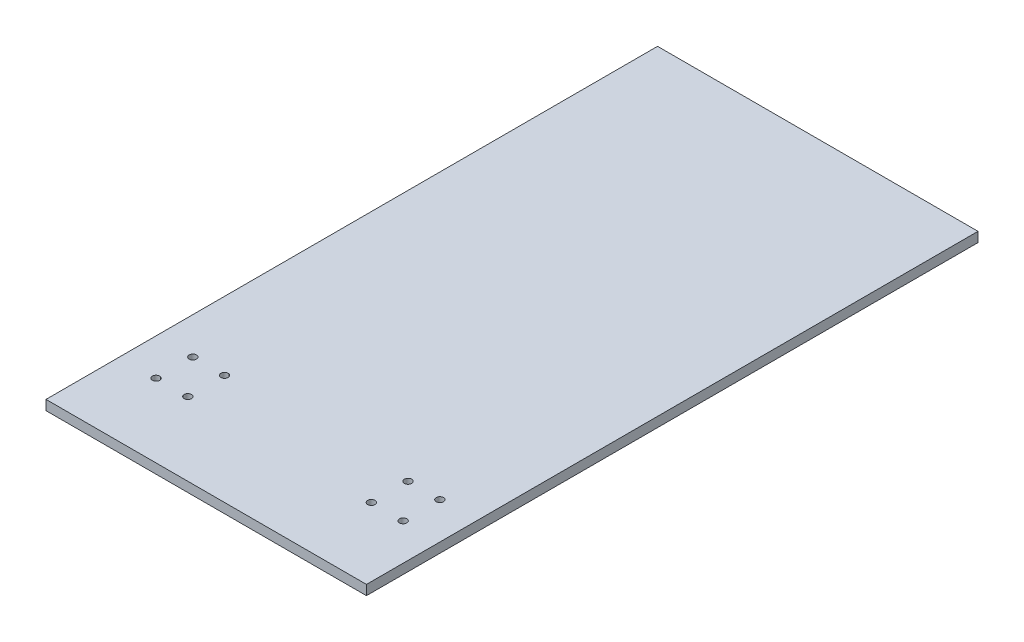
ISO-10303-21;
HEADER;
FILE_DESCRIPTION(('STEP AP214'),'2;1');
FILE_NAME('part.step','',(''),(''),'','','');
FILE_SCHEMA(('AUTOMOTIVE_DESIGN { 1 0 10303 214 1 1 1 1 }'));
ENDSEC;
DATA;
#1=APPLICATION_CONTEXT('core data for automotive mechanical design processes');
#2=APPLICATION_PROTOCOL_DEFINITION('international standard','automotive_design',2000,#1);
#3=PRODUCT_CONTEXT('',#1,'mechanical');
#4=PRODUCT('Part','Part','',(#3));
#5=PRODUCT_RELATED_PRODUCT_CATEGORY('part','',(#4));
#6=PRODUCT_DEFINITION_FORMATION('','',#4);
#7=PRODUCT_DEFINITION_CONTEXT('part definition',#1,'design');
#8=PRODUCT_DEFINITION('design','',#6,#7);
#9=PRODUCT_DEFINITION_SHAPE('','',#8);
#10=(LENGTH_UNIT() NAMED_UNIT(*) SI_UNIT(.MILLI.,.METRE.));
#11=(NAMED_UNIT(*) PLANE_ANGLE_UNIT() SI_UNIT($,.RADIAN.));
#12=(NAMED_UNIT(*) SI_UNIT($,.STERADIAN.) SOLID_ANGLE_UNIT());
#13=UNCERTAINTY_MEASURE_WITH_UNIT(LENGTH_MEASURE(1.E-05),#10,'distance_accuracy_value','');
#14=(GEOMETRIC_REPRESENTATION_CONTEXT(3) GLOBAL_UNCERTAINTY_ASSIGNED_CONTEXT((#13)) GLOBAL_UNIT_ASSIGNED_CONTEXT((#10,
#11,#12)) REPRESENTATION_CONTEXT('',''));
#15=CARTESIAN_POINT('',(0.,0.,0.));
#16=DIRECTION('',(0.,0.,1.));
#17=DIRECTION('',(1.,0.,0.));
#18=AXIS2_PLACEMENT_3D('',#15,#16,#17);
#19=CARTESIAN_POINT('',(0.,4.,0.));
#20=DIRECTION('',(0.,1.,0.));
#21=DIRECTION('',(0.,0.,1.));
#22=AXIS2_PLACEMENT_3D('',#19,#20,#21);
#23=PLANE('',#22);
#24=CARTESIAN_POINT('',(37.5,4.,80.));
#25=DIRECTION('',(0.,1.,0.));
#26=DIRECTION('',(0.,0.,-1.));
#27=AXIS2_PLACEMENT_3D('',#24,#25,#26);
#28=CIRCLE('',#27,1.5);
#29=CARTESIAN_POINT('',(37.5,4.,78.5));
#30=VERTEX_POINT('',#29);
#31=EDGE_CURVE('E146',#30,#30,#28,.T.);
#32=ORIENTED_EDGE('',*,*,#31,.F.);
#33=EDGE_LOOP('',(#32));
#34=FACE_BOUND('',#33,.T.);
#35=CARTESIAN_POINT('',(50.5,4.,95.));
#36=DIRECTION('',(0.,1.,0.));
#37=DIRECTION('',(0.,0.,-1.));
#38=AXIS2_PLACEMENT_3D('',#35,#36,#37);
#39=CIRCLE('',#38,1.5);
#40=CARTESIAN_POINT('',(50.5,4.,93.5));
#41=VERTEX_POINT('',#40);
#42=EDGE_CURVE('E134',#41,#41,#39,.T.);
#43=ORIENTED_EDGE('',*,*,#42,.F.);
#44=EDGE_LOOP('',(#43));
#45=FACE_BOUND('',#44,.T.);
#46=CARTESIAN_POINT('',(-37.5,4.,95.));
#47=DIRECTION('',(0.,1.,0.));
#48=DIRECTION('',(0.,0.,1.));
#49=AXIS2_PLACEMENT_3D('',#46,#47,#48);
#50=CIRCLE('',#49,1.5);
#51=CARTESIAN_POINT('',(-37.5,4.,96.5));
#52=VERTEX_POINT('',#51);
#53=EDGE_CURVE('E122',#52,#52,#50,.T.);
#54=ORIENTED_EDGE('',*,*,#53,.F.);
#55=EDGE_LOOP('',(#54));
#56=FACE_BOUND('',#55,.T.);
#57=CARTESIAN_POINT('',(-50.5,4.,80.));
#58=DIRECTION('',(0.,1.,0.));
#59=DIRECTION('',(0.,0.,1.));
#60=AXIS2_PLACEMENT_3D('',#57,#58,#59);
#61=CIRCLE('',#60,1.5);
#62=CARTESIAN_POINT('',(-50.5,4.,81.5));
#63=VERTEX_POINT('',#62);
#64=EDGE_CURVE('E101',#63,#63,#61,.T.);
#65=ORIENTED_EDGE('',*,*,#64,.F.);
#66=EDGE_LOOP('',(#65));
#67=FACE_BOUND('',#66,.T.);
#68=DIRECTION('',(0.,0.,1.));
#69=VECTOR('',#68,1.);
#70=CARTESIAN_POINT('',(-65.5,4.,-125.));
#71=LINE('',#70,#69);
#72=CARTESIAN_POINT('',(-65.5,4.,-125.));
#73=VERTEX_POINT('',#72);
#74=CARTESIAN_POINT('',(-65.5,4.,125.));
#75=VERTEX_POINT('',#74);
#76=EDGE_CURVE('E86',#73,#75,#71,.T.);
#77=ORIENTED_EDGE('',*,*,#76,.T.);
#78=DIRECTION('',(1.,0.,0.));
#79=VECTOR('',#78,1.);
#80=CARTESIAN_POINT('',(-65.5,4.,125.));
#81=LINE('',#80,#79);
#82=CARTESIAN_POINT('',(65.5,4.,125.));
#83=VERTEX_POINT('',#82);
#84=EDGE_CURVE('E81',#75,#83,#81,.T.);
#85=ORIENTED_EDGE('',*,*,#84,.T.);
#86=DIRECTION('',(0.,0.,-1.));
#87=VECTOR('',#86,1.);
#88=CARTESIAN_POINT('',(65.5,4.,-125.));
#89=LINE('',#88,#87);
#90=CARTESIAN_POINT('',(65.5,4.,-125.));
#91=VERTEX_POINT('',#90);
#92=EDGE_CURVE('E84',#83,#91,#89,.T.);
#93=ORIENTED_EDGE('',*,*,#92,.T.);
#94=DIRECTION('',(-1.,0.,0.));
#95=VECTOR('',#94,1.);
#96=CARTESIAN_POINT('',(-65.5,4.,-125.));
#97=LINE('',#96,#95);
#98=EDGE_CURVE('E51',#91,#73,#97,.T.);
#99=ORIENTED_EDGE('',*,*,#98,.T.);
#100=EDGE_LOOP('',(#77,#85,#93,#99));
#101=FACE_BOUND('',#100,.T.);
#102=CARTESIAN_POINT('',(-37.5,4.,80.));
#103=DIRECTION('',(0.,1.,0.));
#104=DIRECTION('',(0.,0.,1.));
#105=AXIS2_PLACEMENT_3D('',#102,#103,#104);
#106=CIRCLE('',#105,1.5);
#107=CARTESIAN_POINT('',(-37.5,4.,81.5));
#108=VERTEX_POINT('',#107);
#109=EDGE_CURVE('E116',#108,#108,#106,.T.);
#110=ORIENTED_EDGE('',*,*,#109,.F.);
#111=EDGE_LOOP('',(#110));
#112=FACE_BOUND('',#111,.T.);
#113=CARTESIAN_POINT('',(-50.5,4.,95.));
#114=DIRECTION('',(0.,1.,0.));
#115=DIRECTION('',(0.,0.,1.));
#116=AXIS2_PLACEMENT_3D('',#113,#114,#115);
#117=CIRCLE('',#116,1.5);
#118=CARTESIAN_POINT('',(-50.5,4.,96.5));
#119=VERTEX_POINT('',#118);
#120=EDGE_CURVE('E128',#119,#119,#117,.T.);
#121=ORIENTED_EDGE('',*,*,#120,.F.);
#122=EDGE_LOOP('',(#121));
#123=FACE_BOUND('',#122,.T.);
#124=CARTESIAN_POINT('',(37.5,4.,95.));
#125=DIRECTION('',(0.,1.,0.));
#126=DIRECTION('',(0.,0.,-1.));
#127=AXIS2_PLACEMENT_3D('',#124,#125,#126);
#128=CIRCLE('',#127,1.5);
#129=CARTESIAN_POINT('',(37.5,4.,93.5));
#130=VERTEX_POINT('',#129);
#131=EDGE_CURVE('E140',#130,#130,#128,.T.);
#132=ORIENTED_EDGE('',*,*,#131,.F.);
#133=EDGE_LOOP('',(#132));
#134=FACE_BOUND('',#133,.T.);
#135=CARTESIAN_POINT('',(50.5,4.,80.));
#136=DIRECTION('',(0.,1.,0.));
#137=DIRECTION('',(0.,0.,-1.));
#138=AXIS2_PLACEMENT_3D('',#135,#136,#137);
#139=CIRCLE('',#138,1.5);
#140=CARTESIAN_POINT('',(50.5,4.,78.5));
#141=VERTEX_POINT('',#140);
#142=EDGE_CURVE('E152',#141,#141,#139,.T.);
#143=ORIENTED_EDGE('',*,*,#142,.F.);
#144=EDGE_LOOP('',(#143));
#145=FACE_BOUND('',#144,.T.);
#146=ADVANCED_FACE('F34',(#34,#45,#56,#67,#101,#112,#123,#134,#145),#23,.T.);
#147=CARTESIAN_POINT('',(0.,0.,0.));
#148=DIRECTION('',(0.,1.,0.));
#149=DIRECTION('',(0.,0.,1.));
#150=AXIS2_PLACEMENT_3D('',#147,#148,#149);
#151=PLANE('',#150);
#152=DIRECTION('',(0.,0.,1.));
#153=VECTOR('',#152,1.);
#154=CARTESIAN_POINT('',(-65.5,0.,-125.));
#155=LINE('',#154,#153);
#156=CARTESIAN_POINT('',(-65.5,0.,-125.));
#157=VERTEX_POINT('',#156);
#158=CARTESIAN_POINT('',(-65.5,0.,125.));
#159=VERTEX_POINT('',#158);
#160=EDGE_CURVE('E98',#157,#159,#155,.T.);
#161=ORIENTED_EDGE('',*,*,#160,.F.);
#162=DIRECTION('',(-1.,0.,0.));
#163=VECTOR('',#162,1.);
#164=CARTESIAN_POINT('',(-65.5,0.,-125.));
#165=LINE('',#164,#163);
#166=CARTESIAN_POINT('',(65.5,0.,-125.));
#167=VERTEX_POINT('',#166);
#168=EDGE_CURVE('E74',#167,#157,#165,.T.);
#169=ORIENTED_EDGE('',*,*,#168,.F.);
#170=DIRECTION('',(0.,0.,-1.));
#171=VECTOR('',#170,1.);
#172=CARTESIAN_POINT('',(65.5,0.,-125.));
#173=LINE('',#172,#171);
#174=CARTESIAN_POINT('',(65.5,0.,125.));
#175=VERTEX_POINT('',#174);
#176=EDGE_CURVE('E68',#175,#167,#173,.T.);
#177=ORIENTED_EDGE('',*,*,#176,.F.);
#178=DIRECTION('',(1.,0.,0.));
#179=VECTOR('',#178,1.);
#180=CARTESIAN_POINT('',(-65.5,0.,125.));
#181=LINE('',#180,#179);
#182=EDGE_CURVE('E90',#159,#175,#181,.T.);
#183=ORIENTED_EDGE('',*,*,#182,.F.);
#184=EDGE_LOOP('',(#161,#169,#177,#183));
#185=FACE_BOUND('',#184,.T.);
#186=CARTESIAN_POINT('',(-50.5,0.,80.));
#187=DIRECTION('',(0.,1.,0.));
#188=DIRECTION('',(0.,0.,1.));
#189=AXIS2_PLACEMENT_3D('',#186,#187,#188);
#190=CIRCLE('',#189,1.5);
#191=CARTESIAN_POINT('',(-50.5,0.,81.5));
#192=VERTEX_POINT('',#191);
#193=EDGE_CURVE('E113',#192,#192,#190,.T.);
#194=ORIENTED_EDGE('',*,*,#193,.T.);
#195=EDGE_LOOP('',(#194));
#196=FACE_BOUND('',#195,.T.);
#197=CARTESIAN_POINT('',(-37.5,0.,80.));
#198=DIRECTION('',(0.,1.,0.));
#199=DIRECTION('',(0.,0.,1.));
#200=AXIS2_PLACEMENT_3D('',#197,#198,#199);
#201=CIRCLE('',#200,1.5);
#202=CARTESIAN_POINT('',(-37.5,0.,81.5));
#203=VERTEX_POINT('',#202);
#204=EDGE_CURVE('E119',#203,#203,#201,.T.);
#205=ORIENTED_EDGE('',*,*,#204,.T.);
#206=EDGE_LOOP('',(#205));
#207=FACE_BOUND('',#206,.T.);
#208=CARTESIAN_POINT('',(-37.5,0.,95.));
#209=DIRECTION('',(0.,1.,0.));
#210=DIRECTION('',(0.,0.,1.));
#211=AXIS2_PLACEMENT_3D('',#208,#209,#210);
#212=CIRCLE('',#211,1.5);
#213=CARTESIAN_POINT('',(-37.5,0.,96.5));
#214=VERTEX_POINT('',#213);
#215=EDGE_CURVE('E125',#214,#214,#212,.T.);
#216=ORIENTED_EDGE('',*,*,#215,.T.);
#217=EDGE_LOOP('',(#216));
#218=FACE_BOUND('',#217,.T.);
#219=CARTESIAN_POINT('',(-50.5,0.,95.));
#220=DIRECTION('',(0.,1.,0.));
#221=DIRECTION('',(0.,0.,1.));
#222=AXIS2_PLACEMENT_3D('',#219,#220,#221);
#223=CIRCLE('',#222,1.5);
#224=CARTESIAN_POINT('',(-50.5,0.,96.5));
#225=VERTEX_POINT('',#224);
#226=EDGE_CURVE('E131',#225,#225,#223,.T.);
#227=ORIENTED_EDGE('',*,*,#226,.T.);
#228=EDGE_LOOP('',(#227));
#229=FACE_BOUND('',#228,.T.);
#230=CARTESIAN_POINT('',(50.5,0.,95.));
#231=DIRECTION('',(0.,1.,0.));
#232=DIRECTION('',(0.,0.,-1.));
#233=AXIS2_PLACEMENT_3D('',#230,#231,#232);
#234=CIRCLE('',#233,1.5);
#235=CARTESIAN_POINT('',(50.5,0.,93.5));
#236=VERTEX_POINT('',#235);
#237=EDGE_CURVE('E137',#236,#236,#234,.T.);
#238=ORIENTED_EDGE('',*,*,#237,.T.);
#239=EDGE_LOOP('',(#238));
#240=FACE_BOUND('',#239,.T.);
#241=CARTESIAN_POINT('',(37.5,0.,95.));
#242=DIRECTION('',(0.,1.,0.));
#243=DIRECTION('',(0.,0.,-1.));
#244=AXIS2_PLACEMENT_3D('',#241,#242,#243);
#245=CIRCLE('',#244,1.5);
#246=CARTESIAN_POINT('',(37.5,0.,93.5));
#247=VERTEX_POINT('',#246);
#248=EDGE_CURVE('E143',#247,#247,#245,.T.);
#249=ORIENTED_EDGE('',*,*,#248,.T.);
#250=EDGE_LOOP('',(#249));
#251=FACE_BOUND('',#250,.T.);
#252=CARTESIAN_POINT('',(37.5,0.,80.));
#253=DIRECTION('',(0.,1.,0.));
#254=DIRECTION('',(0.,0.,-1.));
#255=AXIS2_PLACEMENT_3D('',#252,#253,#254);
#256=CIRCLE('',#255,1.5);
#257=CARTESIAN_POINT('',(37.5,0.,78.5));
#258=VERTEX_POINT('',#257);
#259=EDGE_CURVE('E149',#258,#258,#256,.T.);
#260=ORIENTED_EDGE('',*,*,#259,.T.);
#261=EDGE_LOOP('',(#260));
#262=FACE_BOUND('',#261,.T.);
#263=CARTESIAN_POINT('',(50.5,0.,80.));
#264=DIRECTION('',(0.,1.,0.));
#265=DIRECTION('',(0.,0.,-1.));
#266=AXIS2_PLACEMENT_3D('',#263,#264,#265);
#267=CIRCLE('',#266,1.5);
#268=CARTESIAN_POINT('',(50.5,0.,78.5));
#269=VERTEX_POINT('',#268);
#270=EDGE_CURVE('E155',#269,#269,#267,.T.);
#271=ORIENTED_EDGE('',*,*,#270,.T.);
#272=EDGE_LOOP('',(#271));
#273=FACE_BOUND('',#272,.T.);
#274=ADVANCED_FACE('F109',(#185,#196,#207,#218,#229,#240,#251,#262,#273),#151,.F.);
#275=CARTESIAN_POINT('',(-65.5,4.,-125.));
#276=DIRECTION('',(1.,0.,0.));
#277=DIRECTION('',(0.,0.,-1.));
#278=AXIS2_PLACEMENT_3D('',#275,#276,#277);
#279=PLANE('',#278);
#280=ORIENTED_EDGE('',*,*,#160,.T.);
#281=DIRECTION('',(0.,-1.,0.));
#282=VECTOR('',#281,1.);
#283=CARTESIAN_POINT('',(-65.5,4.,125.));
#284=LINE('',#283,#282);
#285=EDGE_CURVE('E11',#75,#159,#284,.T.);
#286=ORIENTED_EDGE('',*,*,#285,.F.);
#287=ORIENTED_EDGE('',*,*,#76,.F.);
#288=DIRECTION('',(0.,-1.,0.));
#289=VECTOR('',#288,1.);
#290=CARTESIAN_POINT('',(-65.5,4.,-125.));
#291=LINE('',#290,#289);
#292=EDGE_CURVE('E94',#73,#157,#291,.T.);
#293=ORIENTED_EDGE('',*,*,#292,.T.);
#294=EDGE_LOOP('',(#280,#286,#287,#293));
#295=FACE_BOUND('',#294,.T.);
#296=ADVANCED_FACE('F36',(#295),#279,.F.);
#297=CARTESIAN_POINT('',(-65.5,4.,125.));
#298=DIRECTION('',(0.,0.,-1.));
#299=DIRECTION('',(-1.,0.,0.));
#300=AXIS2_PLACEMENT_3D('',#297,#298,#299);
#301=PLANE('',#300);
#302=ORIENTED_EDGE('',*,*,#182,.T.);
#303=DIRECTION('',(0.,-1.,0.));
#304=VECTOR('',#303,1.);
#305=CARTESIAN_POINT('',(65.5,4.,125.));
#306=LINE('',#305,#304);
#307=EDGE_CURVE('E43',#83,#175,#306,.T.);
#308=ORIENTED_EDGE('',*,*,#307,.F.);
#309=ORIENTED_EDGE('',*,*,#84,.F.);
#310=ORIENTED_EDGE('',*,*,#285,.T.);
#311=EDGE_LOOP('',(#302,#308,#309,#310));
#312=FACE_BOUND('',#311,.T.);
#313=ADVANCED_FACE('F89',(#312),#301,.F.);
#314=CARTESIAN_POINT('',(65.5,4.,-125.));
#315=DIRECTION('',(-1.,0.,0.));
#316=DIRECTION('',(0.,0.,1.));
#317=AXIS2_PLACEMENT_3D('',#314,#315,#316);
#318=PLANE('',#317);
#319=ORIENTED_EDGE('',*,*,#176,.T.);
#320=DIRECTION('',(0.,-1.,0.));
#321=VECTOR('',#320,1.);
#322=CARTESIAN_POINT('',(65.5,4.,-125.));
#323=LINE('',#322,#321);
#324=EDGE_CURVE('E91',#91,#167,#323,.T.);
#325=ORIENTED_EDGE('',*,*,#324,.F.);
#326=ORIENTED_EDGE('',*,*,#92,.F.);
#327=ORIENTED_EDGE('',*,*,#307,.T.);
#328=EDGE_LOOP('',(#319,#325,#326,#327));
#329=FACE_BOUND('',#328,.T.);
#330=ADVANCED_FACE('F92',(#329),#318,.F.);
#331=CARTESIAN_POINT('',(-65.5,4.,-125.));
#332=DIRECTION('',(0.,0.,1.));
#333=DIRECTION('',(1.,0.,0.));
#334=AXIS2_PLACEMENT_3D('',#331,#332,#333);
#335=PLANE('',#334);
#336=ORIENTED_EDGE('',*,*,#168,.T.);
#337=ORIENTED_EDGE('',*,*,#292,.F.);
#338=ORIENTED_EDGE('',*,*,#98,.F.);
#339=ORIENTED_EDGE('',*,*,#324,.T.);
#340=EDGE_LOOP('',(#336,#337,#338,#339));
#341=FACE_BOUND('',#340,.T.);
#342=ADVANCED_FACE('F106',(#341),#335,.F.);
#343=CARTESIAN_POINT('',(-50.5,4.,80.));
#344=DIRECTION('',(0.,-1.,0.));
#345=DIRECTION('',(0.,0.,-1.));
#346=AXIS2_PLACEMENT_3D('',#343,#344,#345);
#347=CYLINDRICAL_SURFACE('',#346,1.5);
#348=ORIENTED_EDGE('',*,*,#64,.T.);
#349=EDGE_LOOP('',(#348));
#350=FACE_BOUND('',#349,.T.);
#351=ORIENTED_EDGE('',*,*,#193,.F.);
#352=EDGE_LOOP('',(#351));
#353=FACE_BOUND('',#352,.T.);
#354=ADVANCED_FACE('F174',(#350,#353),#347,.F.);
#355=CARTESIAN_POINT('',(-37.5,4.,80.));
#356=DIRECTION('',(0.,-1.,0.));
#357=DIRECTION('',(0.,0.,-1.));
#358=AXIS2_PLACEMENT_3D('',#355,#356,#357);
#359=CYLINDRICAL_SURFACE('',#358,1.5);
#360=ORIENTED_EDGE('',*,*,#109,.T.);
#361=EDGE_LOOP('',(#360));
#362=FACE_BOUND('',#361,.T.);
#363=ORIENTED_EDGE('',*,*,#204,.F.);
#364=EDGE_LOOP('',(#363));
#365=FACE_BOUND('',#364,.T.);
#366=ADVANCED_FACE('F220',(#362,#365),#359,.F.);
#367=CARTESIAN_POINT('',(-37.5,4.,95.));
#368=DIRECTION('',(0.,-1.,0.));
#369=DIRECTION('',(0.,0.,-1.));
#370=AXIS2_PLACEMENT_3D('',#367,#368,#369);
#371=CYLINDRICAL_SURFACE('',#370,1.5);
#372=ORIENTED_EDGE('',*,*,#53,.T.);
#373=EDGE_LOOP('',(#372));
#374=FACE_BOUND('',#373,.T.);
#375=ORIENTED_EDGE('',*,*,#215,.F.);
#376=EDGE_LOOP('',(#375));
#377=FACE_BOUND('',#376,.T.);
#378=ADVANCED_FACE('F228',(#374,#377),#371,.F.);
#379=CARTESIAN_POINT('',(-50.5,4.,95.));
#380=DIRECTION('',(0.,-1.,0.));
#381=DIRECTION('',(0.,0.,-1.));
#382=AXIS2_PLACEMENT_3D('',#379,#380,#381);
#383=CYLINDRICAL_SURFACE('',#382,1.5);
#384=ORIENTED_EDGE('',*,*,#120,.T.);
#385=EDGE_LOOP('',(#384));
#386=FACE_BOUND('',#385,.T.);
#387=ORIENTED_EDGE('',*,*,#226,.F.);
#388=EDGE_LOOP('',(#387));
#389=FACE_BOUND('',#388,.T.);
#390=ADVANCED_FACE('F236',(#386,#389),#383,.F.);
#391=CARTESIAN_POINT('',(50.5,4.,95.));
#392=DIRECTION('',(0.,-1.,0.));
#393=DIRECTION('',(0.,0.,-1.));
#394=AXIS2_PLACEMENT_3D('',#391,#392,#393);
#395=CYLINDRICAL_SURFACE('',#394,1.5);
#396=ORIENTED_EDGE('',*,*,#42,.T.);
#397=EDGE_LOOP('',(#396));
#398=FACE_BOUND('',#397,.T.);
#399=ORIENTED_EDGE('',*,*,#237,.F.);
#400=EDGE_LOOP('',(#399));
#401=FACE_BOUND('',#400,.T.);
#402=ADVANCED_FACE('F245',(#398,#401),#395,.F.);
#403=CARTESIAN_POINT('',(37.5,4.,95.));
#404=DIRECTION('',(0.,-1.,0.));
#405=DIRECTION('',(0.,0.,-1.));
#406=AXIS2_PLACEMENT_3D('',#403,#404,#405);
#407=CYLINDRICAL_SURFACE('',#406,1.5);
#408=ORIENTED_EDGE('',*,*,#131,.T.);
#409=EDGE_LOOP('',(#408));
#410=FACE_BOUND('',#409,.T.);
#411=ORIENTED_EDGE('',*,*,#248,.F.);
#412=EDGE_LOOP('',(#411));
#413=FACE_BOUND('',#412,.T.);
#414=ADVANCED_FACE('F254',(#410,#413),#407,.F.);
#415=CARTESIAN_POINT('',(37.5,4.,80.));
#416=DIRECTION('',(0.,-1.,0.));
#417=DIRECTION('',(0.,0.,-1.));
#418=AXIS2_PLACEMENT_3D('',#415,#416,#417);
#419=CYLINDRICAL_SURFACE('',#418,1.5);
#420=ORIENTED_EDGE('',*,*,#31,.T.);
#421=EDGE_LOOP('',(#420));
#422=FACE_BOUND('',#421,.T.);
#423=ORIENTED_EDGE('',*,*,#259,.F.);
#424=EDGE_LOOP('',(#423));
#425=FACE_BOUND('',#424,.T.);
#426=ADVANCED_FACE('F263',(#422,#425),#419,.F.);
#427=CARTESIAN_POINT('',(50.5,4.,80.));
#428=DIRECTION('',(0.,-1.,0.));
#429=DIRECTION('',(0.,0.,-1.));
#430=AXIS2_PLACEMENT_3D('',#427,#428,#429);
#431=CYLINDRICAL_SURFACE('',#430,1.5);
#432=ORIENTED_EDGE('',*,*,#142,.T.);
#433=EDGE_LOOP('',(#432));
#434=FACE_BOUND('',#433,.T.);
#435=ORIENTED_EDGE('',*,*,#270,.F.);
#436=EDGE_LOOP('',(#435));
#437=FACE_BOUND('',#436,.T.);
#438=ADVANCED_FACE('F161',(#434,#437),#431,.F.);
#439=CLOSED_SHELL('',(#146,#274,#296,#313,#330,#342,#354,#366,#378,#390,#402,#414,#426,#438));
#440=MANIFOLD_SOLID_BREP('B2',#439);
#441=ADVANCED_BREP_SHAPE_REPRESENTATION('',(#18,#440),#14);
#442=SHAPE_DEFINITION_REPRESENTATION(#9,#441);
ENDSEC;
END-ISO-10303-21;
